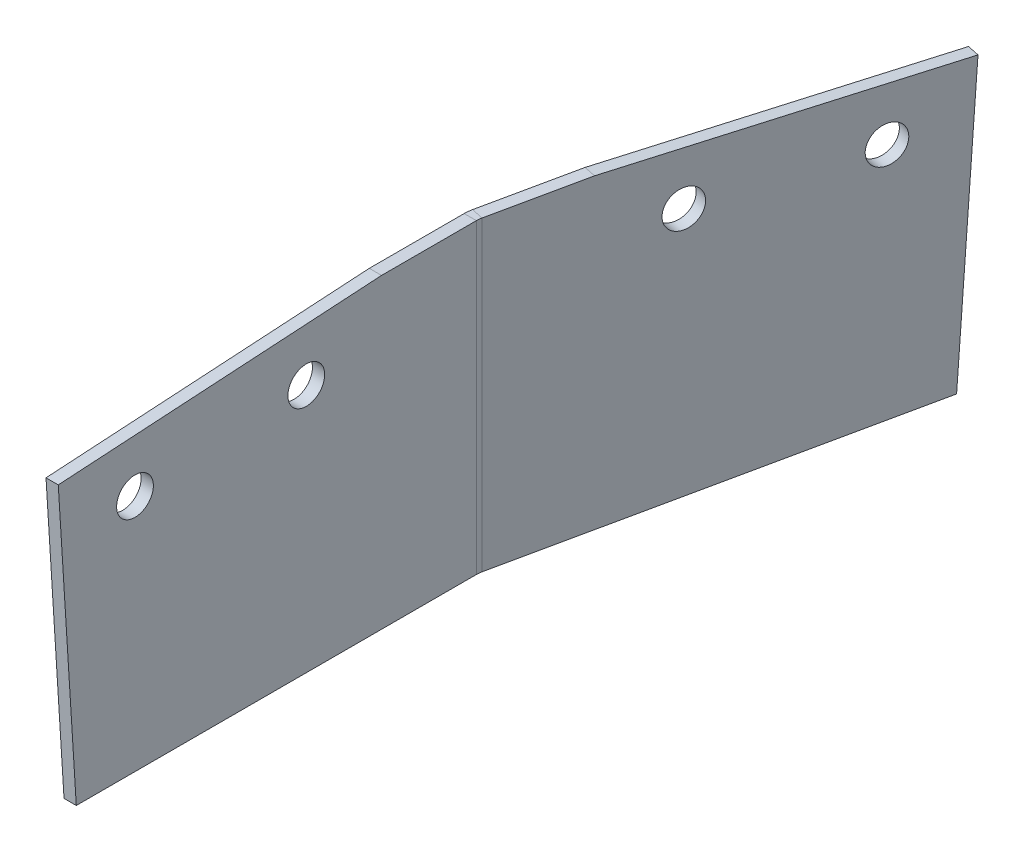
ISO-10303-21;
HEADER;
FILE_DESCRIPTION(('STEP AP214'),'2;1');
FILE_NAME('part.step','',(''),(''),'','','');
FILE_SCHEMA(('AUTOMOTIVE_DESIGN { 1 0 10303 214 1 1 1 1 }'));
ENDSEC;
DATA;
#1=APPLICATION_CONTEXT('core data for automotive mechanical design processes');
#2=APPLICATION_PROTOCOL_DEFINITION('international standard','automotive_design',2000,#1);
#3=PRODUCT_CONTEXT('',#1,'mechanical');
#4=PRODUCT('Part','Part','',(#3));
#5=PRODUCT_RELATED_PRODUCT_CATEGORY('part','',(#4));
#6=PRODUCT_DEFINITION_FORMATION('','',#4);
#7=PRODUCT_DEFINITION_CONTEXT('part definition',#1,'design');
#8=PRODUCT_DEFINITION('design','',#6,#7);
#9=PRODUCT_DEFINITION_SHAPE('','',#8);
#10=(LENGTH_UNIT() NAMED_UNIT(*) SI_UNIT(.MILLI.,.METRE.));
#11=(NAMED_UNIT(*) PLANE_ANGLE_UNIT() SI_UNIT($,.RADIAN.));
#12=(NAMED_UNIT(*) SI_UNIT($,.STERADIAN.) SOLID_ANGLE_UNIT());
#13=UNCERTAINTY_MEASURE_WITH_UNIT(LENGTH_MEASURE(1.E-05),#10,'distance_accuracy_value','');
#14=(GEOMETRIC_REPRESENTATION_CONTEXT(3) GLOBAL_UNCERTAINTY_ASSIGNED_CONTEXT((#13)) GLOBAL_UNIT_ASSIGNED_CONTEXT((#10,
#11,#12)) REPRESENTATION_CONTEXT('',''));
#15=CARTESIAN_POINT('',(0.,0.,0.));
#16=DIRECTION('',(0.,0.,1.));
#17=DIRECTION('',(1.,0.,0.));
#18=AXIS2_PLACEMENT_3D('',#15,#16,#17);
#19=CARTESIAN_POINT('',(-0.988873955573792,0.,-0.105857241604812));
#20=DIRECTION('',(0.978147600733805,0.,0.20791169081776));
#21=DIRECTION('',(0.20791169081776,0.,-0.978147600733806));
#22=AXIS2_PLACEMENT_3D('',#19,#20,#21);
#23=PLANE('',#22);
#24=CARTESIAN_POINT('',(1.95072377383127,7.81650663822684,-13.9355772291183));
#25=DIRECTION('',(0.978147600733805,0.,0.20791169081776));
#26=DIRECTION('',(0.20791169081776,0.,-0.978147600733806));
#27=AXIS2_PLACEMENT_3D('',#24,#25,#26);
#28=CIRCLE('',#27,1.5);
#29=CARTESIAN_POINT('',(2.2625913100579,7.81650663822684,-15.402798630219));
#30=VERTEX_POINT('',#29);
#31=EDGE_CURVE('E481',#30,#30,#28,.T.);
#32=ORIENTED_EDGE('',*,*,#31,.T.);
#33=EDGE_LOOP('',(#32));
#34=FACE_BOUND('',#33,.T.);
#35=CARTESIAN_POINT('',(4.85605828428634,6.96182708473889,-27.6041014451121));
#36=DIRECTION('',(0.978147600733805,0.,0.20791169081776));
#37=DIRECTION('',(0.20791169081776,0.,-0.978147600733806));
#38=AXIS2_PLACEMENT_3D('',#35,#36,#37);
#39=CIRCLE('',#38,1.5);
#40=CARTESIAN_POINT('',(5.16792582051298,6.96182708473889,-29.0713228462128));
#41=VERTEX_POINT('',#40);
#42=EDGE_CURVE('E483',#41,#41,#39,.T.);
#43=ORIENTED_EDGE('',*,*,#42,.T.);
#44=EDGE_LOOP('',(#43));
#45=FACE_BOUND('',#44,.T.);
#46=DIRECTION('',(0.20791169081776,0.,-0.978147600733806));
#47=VECTOR('',#46,1.);
#48=CARTESIAN_POINT('',(-7.82916858347809,-12.5,32.0751988225374));
#49=LINE('',#48,#47);
#50=CARTESIAN_POINT('',(-0.934442802201417,-12.5,-0.361935684654126));
#51=VERTEX_POINT('',#50);
#52=CARTESIAN_POINT('',(5.85142067233051,-12.5,-32.286913305747));
#53=VERTEX_POINT('',#52);
#54=EDGE_CURVE('E48',#51,#53,#49,.T.);
#55=ORIENTED_EDGE('',*,*,#54,.F.);
#56=DIRECTION('',(0.,1.,0.));
#57=VECTOR('',#56,1.);
#58=CARTESIAN_POINT('',(-0.934442802201416,0.,-0.361935684654129));
#59=LINE('',#58,#57);
#60=CARTESIAN_POINT('',(-0.934442802201417,12.5,-0.361935684654129));
#61=VERTEX_POINT('',#60);
#62=EDGE_CURVE('E147',#51,#61,#59,.T.);
#63=ORIENTED_EDGE('',*,*,#62,.T.);
#64=DIRECTION('',(-0.20791169081776,0.,0.978147600733806));
#65=VECTOR('',#64,1.);
#66=CARTESIAN_POINT('',(-2.65216748211587,12.5,7.71932356426563));
#67=LINE('',#66,#65);
#68=CARTESIAN_POINT('',(0.674419570968286,12.5,-7.93103804747526));
#69=VERTEX_POINT('',#68);
#70=EDGE_CURVE('E180',#69,#61,#67,.T.);
#71=ORIENTED_EDGE('',*,*,#70,.F.);
#72=DIRECTION('',(-0.207523893603934,0.0610485395348535,0.97632315828527));
#73=VECTOR('',#72,1.);
#74=CARTESIAN_POINT('',(0.674419570968286,12.5,-7.93103804747526));
#75=LINE('',#74,#73);
#76=CARTESIAN_POINT('',(6.15733962512973,10.8870567582365,-33.7261488221464));
#77=VERTEX_POINT('',#76);
#78=EDGE_CURVE('E177',#77,#69,#75,.T.);
#79=ORIENTED_EDGE('',*,*,#78,.F.);
#80=DIRECTION('',(0.0130548830826643,0.998026728428272,-0.0614183960264231));
#81=VECTOR('',#80,1.);
#82=CARTESIAN_POINT('',(6.15733962512973,10.8870567582365,-33.7261488221464));
#83=LINE('',#82,#81);
#84=EDGE_CURVE('E174',#53,#77,#83,.T.);
#85=ORIENTED_EDGE('',*,*,#84,.F.);
#86=EDGE_LOOP('',(#55,#63,#71,#79,#85));
#87=FACE_BOUND('',#86,.T.);
#88=ADVANCED_FACE('F44',(#34,#45,#87),#23,.F.);
#89=CARTESIAN_POINT('',(-2.65216748211587,12.5,7.71932356426563));
#90=DIRECTION('',(0.,1.,0.));
#91=DIRECTION('',(-0.20791169081776,0.,0.978147600733806));
#92=AXIS2_PLACEMENT_3D('',#89,#90,#91);
#93=PLANE('',#92);
#94=DIRECTION('',(-0.978147600733806,0.,-0.20791169081776));
#95=VECTOR('',#94,1.);
#96=CARTESIAN_POINT('',(-0.934442802201417,12.5,-0.36193568465413));
#97=LINE('',#96,#95);
#98=CARTESIAN_POINT('',(0.0437047985323894,12.5,-0.15402399383637));
#99=VERTEX_POINT('',#98);
#100=EDGE_CURVE('E12',#99,#61,#97,.T.);
#101=ORIENTED_EDGE('',*,*,#100,.F.);
#102=DIRECTION('',(-0.20791169081776,0.,0.978147600733806));
#103=VECTOR('',#102,1.);
#104=CARTESIAN_POINT('',(-1.67401988138206,12.5,7.92723525508339));
#105=LINE('',#104,#103);
#106=CARTESIAN_POINT('',(1.65256717170209,12.5,-7.7231263566575));
#107=VERTEX_POINT('',#106);
#108=EDGE_CURVE('E61',#107,#99,#105,.T.);
#109=ORIENTED_EDGE('',*,*,#108,.F.);
#110=DIRECTION('',(0.978147600733806,0.,0.20791169081776));
#111=VECTOR('',#110,1.);
#112=CARTESIAN_POINT('',(0.674419570968286,12.5,-7.93103804747526));
#113=LINE('',#112,#111);
#114=EDGE_CURVE('E186',#69,#107,#113,.T.);
#115=ORIENTED_EDGE('',*,*,#114,.F.);
#116=ORIENTED_EDGE('',*,*,#70,.T.);
#117=EDGE_LOOP('',(#101,#109,#115,#116));
#118=FACE_BOUND('',#117,.T.);
#119=ADVANCED_FACE('F46',(#118),#93,.T.);
#120=CARTESIAN_POINT('',(0.674419570968286,12.5,-7.93103804747526));
#121=DIRECTION('',(0.0126927050766462,0.998134798421867,-0.0597144824743198));
#122=DIRECTION('',(-0.207523893603934,0.0610485395348535,0.97632315828527));
#123=AXIS2_PLACEMENT_3D('',#120,#121,#122);
#124=PLANE('',#123);
#125=DIRECTION('',(-0.207523893603934,0.0610485395348535,0.97632315828527));
#126=VECTOR('',#125,1.);
#127=CARTESIAN_POINT('',(1.65256717170209,12.5,-7.7231263566575));
#128=LINE('',#127,#126);
#129=CARTESIAN_POINT('',(7.13548722586353,10.8870567582365,-33.5182371313286));
#130=VERTEX_POINT('',#129);
#131=EDGE_CURVE('E184',#130,#107,#128,.T.);
#132=ORIENTED_EDGE('',*,*,#131,.F.);
#133=DIRECTION('',(0.978147600733806,0.,0.20791169081776));
#134=VECTOR('',#133,1.);
#135=CARTESIAN_POINT('',(6.15733962512973,10.8870567582365,-33.7261488221464));
#136=LINE('',#135,#134);
#137=EDGE_CURVE('E188',#77,#130,#136,.T.);
#138=ORIENTED_EDGE('',*,*,#137,.F.);
#139=ORIENTED_EDGE('',*,*,#78,.T.);
#140=ORIENTED_EDGE('',*,*,#114,.T.);
#141=EDGE_LOOP('',(#132,#138,#139,#140));
#142=FACE_BOUND('',#141,.T.);
#143=ADVANCED_FACE('F246',(#142),#124,.T.);
#144=CARTESIAN_POINT('',(6.15733962512973,10.8870567582365,-33.7261488221464));
#145=DIRECTION('',(0.207501424588839,-0.0627905195293094,-0.976217449880324));
#146=DIRECTION('',(0.0130548830826643,0.998026728428272,-0.0614183960264232));
#147=AXIS2_PLACEMENT_3D('',#144,#145,#146);
#148=PLANE('',#147);
#149=DIRECTION('',(0.0130548830826643,0.998026728428272,-0.0614183960264231));
#150=VECTOR('',#149,1.);
#151=CARTESIAN_POINT('',(7.13548722586353,10.8870567582365,-33.5182371313286));
#152=LINE('',#151,#150);
#153=CARTESIAN_POINT('',(6.82956827306431,-12.5,-32.0790016149293));
#154=VERTEX_POINT('',#153);
#155=EDGE_CURVE('E181',#154,#130,#152,.T.);
#156=ORIENTED_EDGE('',*,*,#155,.F.);
#157=DIRECTION('',(0.978147600733806,0.,0.20791169081776));
#158=VECTOR('',#157,1.);
#159=CARTESIAN_POINT('',(5.85142067233051,-12.5,-32.286913305747));
#160=LINE('',#159,#158);
#161=EDGE_CURVE('E190',#53,#154,#160,.T.);
#162=ORIENTED_EDGE('',*,*,#161,.F.);
#163=ORIENTED_EDGE('',*,*,#84,.T.);
#164=ORIENTED_EDGE('',*,*,#137,.T.);
#165=EDGE_LOOP('',(#156,#162,#163,#164));
#166=FACE_BOUND('',#165,.T.);
#167=ADVANCED_FACE('F252',(#166),#148,.T.);
#168=CARTESIAN_POINT('',(-7.82916858347809,-12.5,32.0751988225374));
#169=DIRECTION('',(0.,-1.,0.));
#170=DIRECTION('',(0.20791169081776,0.,-0.978147600733806));
#171=AXIS2_PLACEMENT_3D('',#168,#169,#170);
#172=PLANE('',#171);
#173=DIRECTION('',(0.978147600733806,0.,0.20791169081776));
#174=VECTOR('',#173,1.);
#175=CARTESIAN_POINT('',(-0.934442802201419,-12.5,-0.361935684654127));
#176=LINE('',#175,#174);
#177=CARTESIAN_POINT('',(0.0437047985323887,-12.5,-0.154023993836367));
#178=VERTEX_POINT('',#177);
#179=EDGE_CURVE('E193',#51,#178,#176,.T.);
#180=ORIENTED_EDGE('',*,*,#179,.F.);
#181=ORIENTED_EDGE('',*,*,#54,.T.);
#182=ORIENTED_EDGE('',*,*,#161,.T.);
#183=DIRECTION('',(0.20791169081776,0.,-0.978147600733806));
#184=VECTOR('',#183,1.);
#185=CARTESIAN_POINT('',(-6.85102098274428,-12.5,32.2831105133552));
#186=LINE('',#185,#184);
#187=EDGE_CURVE('E69',#178,#154,#186,.T.);
#188=ORIENTED_EDGE('',*,*,#187,.F.);
#189=EDGE_LOOP('',(#180,#181,#182,#188));
#190=FACE_BOUND('',#189,.T.);
#191=ADVANCED_FACE('F237',(#190),#172,.T.);
#192=CARTESIAN_POINT('',(-0.0107263548399864,0.,0.102054449212948));
#193=DIRECTION('',(0.978147600733805,0.,0.20791169081776));
#194=DIRECTION('',(0.20791169081776,0.,-0.978147600733806));
#195=AXIS2_PLACEMENT_3D('',#192,#193,#194);
#196=PLANE('',#195);
#197=CARTESIAN_POINT('',(2.92887137456507,7.81650663822684,-13.7276655383006));
#198=DIRECTION('',(0.978147600733805,0.,0.20791169081776));
#199=DIRECTION('',(0.20791169081776,0.,-0.978147600733806));
#200=AXIS2_PLACEMENT_3D('',#197,#198,#199);
#201=CIRCLE('',#200,1.5);
#202=CARTESIAN_POINT('',(3.24073891079171,7.81650663822684,-15.1948869394013));
#203=VERTEX_POINT('',#202);
#204=EDGE_CURVE('E479',#203,#203,#201,.T.);
#205=ORIENTED_EDGE('',*,*,#204,.F.);
#206=EDGE_LOOP('',(#205));
#207=FACE_BOUND('',#206,.T.);
#208=CARTESIAN_POINT('',(5.83420588502015,6.96182708473889,-27.3961897542943));
#209=DIRECTION('',(0.978147600733805,0.,0.20791169081776));
#210=DIRECTION('',(0.20791169081776,0.,-0.978147600733806));
#211=AXIS2_PLACEMENT_3D('',#208,#209,#210);
#212=CIRCLE('',#211,1.5);
#213=CARTESIAN_POINT('',(6.14607342124679,6.96182708473889,-28.863411155395));
#214=VERTEX_POINT('',#213);
#215=EDGE_CURVE('E494',#214,#214,#212,.T.);
#216=ORIENTED_EDGE('',*,*,#215,.F.);
#217=EDGE_LOOP('',(#216));
#218=FACE_BOUND('',#217,.T.);
#219=DIRECTION('',(0.,1.,0.));
#220=VECTOR('',#219,1.);
#221=CARTESIAN_POINT('',(0.0437047985323893,0.,-0.15402399383637));
#222=LINE('',#221,#220);
#223=EDGE_CURVE('E53',#178,#99,#222,.T.);
#224=ORIENTED_EDGE('',*,*,#223,.F.);
#225=ORIENTED_EDGE('',*,*,#187,.T.);
#226=ORIENTED_EDGE('',*,*,#155,.T.);
#227=ORIENTED_EDGE('',*,*,#131,.T.);
#228=ORIENTED_EDGE('',*,*,#108,.T.);
#229=EDGE_LOOP('',(#224,#225,#226,#227,#228));
#230=FACE_BOUND('',#229,.T.);
#231=ADVANCED_FACE('F230',(#207,#218,#230),#196,.T.);
#232=CARTESIAN_POINT('',(-1.,12.5,8.));
#233=DIRECTION('',(0.,0.998134798421867,0.0610485395348537));
#234=DIRECTION('',(0.,-0.0610485395348537,0.998134798421867));
#235=AXIS2_PLACEMENT_3D('',#232,#233,#234);
#236=PLANE('',#235);
#237=DIRECTION('',(0.,-0.0610485395348537,0.998134798421867));
#238=VECTOR('',#237,1.);
#239=CARTESIAN_POINT('',(0.,12.5,8.));
#240=LINE('',#239,#238);
#241=CARTESIAN_POINT('',(0.,12.5,8.));
#242=VERTEX_POINT('',#241);
#243=CARTESIAN_POINT('',(0.,10.8870567582365,34.3713888939866));
#244=VERTEX_POINT('',#243);
#245=EDGE_CURVE('E214',#242,#244,#240,.T.);
#246=ORIENTED_EDGE('',*,*,#245,.F.);
#247=DIRECTION('',(1.,0.,0.));
#248=VECTOR('',#247,1.);
#249=CARTESIAN_POINT('',(-1.,12.5,8.));
#250=LINE('',#249,#248);
#251=CARTESIAN_POINT('',(-1.,12.5,8.));
#252=VERTEX_POINT('',#251);
#253=EDGE_CURVE('E198',#252,#242,#250,.T.);
#254=ORIENTED_EDGE('',*,*,#253,.F.);
#255=DIRECTION('',(0.,-0.0610485395348537,0.998134798421867));
#256=VECTOR('',#255,1.);
#257=CARTESIAN_POINT('',(-1.,12.5,8.));
#258=LINE('',#257,#256);
#259=CARTESIAN_POINT('',(-1.,10.8870567582365,34.3713888939866));
#260=VERTEX_POINT('',#259);
#261=EDGE_CURVE('E160',#252,#260,#258,.T.);
#262=ORIENTED_EDGE('',*,*,#261,.T.);
#263=DIRECTION('',(1.,0.,0.));
#264=VECTOR('',#263,1.);
#265=CARTESIAN_POINT('',(-1.,10.8870567582365,34.3713888939866));
#266=LINE('',#265,#264);
#267=EDGE_CURVE('E170',#260,#244,#266,.T.);
#268=ORIENTED_EDGE('',*,*,#267,.T.);
#269=EDGE_LOOP('',(#246,#254,#262,#268));
#270=FACE_BOUND('',#269,.T.);
#271=ADVANCED_FACE('F228',(#270),#236,.T.);
#272=CARTESIAN_POINT('',(-1.,10.8870567582365,34.3713888939866));
#273=DIRECTION('',(0.,-0.0627905195293094,0.998026728428272));
#274=DIRECTION('',(0.,-0.998026728428272,-0.0627905195293094));
#275=AXIS2_PLACEMENT_3D('',#272,#273,#274);
#276=PLANE('',#275);
#277=DIRECTION('',(0.,-0.998026728428272,-0.0627905195293094));
#278=VECTOR('',#277,1.);
#279=CARTESIAN_POINT('',(0.,10.8870567582365,34.3713888939866));
#280=LINE('',#279,#278);
#281=CARTESIAN_POINT('',(0.,-12.5,32.9));
#282=VERTEX_POINT('',#281);
#283=EDGE_CURVE('E211',#244,#282,#280,.T.);
#284=ORIENTED_EDGE('',*,*,#283,.F.);
#285=ORIENTED_EDGE('',*,*,#267,.F.);
#286=DIRECTION('',(0.,-0.998026728428272,-0.0627905195293094));
#287=VECTOR('',#286,1.);
#288=CARTESIAN_POINT('',(-1.,10.8870567582365,34.3713888939866));
#289=LINE('',#288,#287);
#290=CARTESIAN_POINT('',(-1.,-12.5,32.9));
#291=VERTEX_POINT('',#290);
#292=EDGE_CURVE('E165',#260,#291,#289,.T.);
#293=ORIENTED_EDGE('',*,*,#292,.T.);
#294=DIRECTION('',(1.,0.,0.));
#295=VECTOR('',#294,1.);
#296=CARTESIAN_POINT('',(-1.,-12.5,32.9));
#297=LINE('',#296,#295);
#298=EDGE_CURVE('E163',#291,#282,#297,.T.);
#299=ORIENTED_EDGE('',*,*,#298,.T.);
#300=EDGE_LOOP('',(#284,#285,#293,#299));
#301=FACE_BOUND('',#300,.T.);
#302=ADVANCED_FACE('F226',(#301),#276,.T.);
#303=CARTESIAN_POINT('',(-1.,0.,0.));
#304=DIRECTION('',(1.,0.,0.));
#305=DIRECTION('',(0.,0.,-1.));
#306=AXIS2_PLACEMENT_3D('',#303,#304,#305);
#307=PLANE('',#306);
#308=CARTESIAN_POINT('',(-0.999999999999999,6.96182708473888,28.1125713367575));
#309=DIRECTION('',(1.,0.,0.));
#310=DIRECTION('',(0.,0.,-1.));
#311=AXIS2_PLACEMENT_3D('',#308,#309,#310);
#312=CIRCLE('',#311,1.5);
#313=CARTESIAN_POINT('',(-0.999999999999999,6.96182708473888,26.6125713367575));
#314=VERTEX_POINT('',#313);
#315=EDGE_CURVE('E263',#314,#314,#312,.T.);
#316=ORIENTED_EDGE('',*,*,#315,.T.);
#317=EDGE_LOOP('',(#316));
#318=FACE_BOUND('',#317,.T.);
#319=CARTESIAN_POINT('',(-0.999999999999999,7.81650663822684,14.1386841588513));
#320=DIRECTION('',(1.,0.,0.));
#321=DIRECTION('',(0.,0.,-1.));
#322=AXIS2_PLACEMENT_3D('',#319,#320,#321);
#323=CIRCLE('',#322,1.5);
#324=CARTESIAN_POINT('',(-0.999999999999999,7.81650663822684,12.6386841588513));
#325=VERTEX_POINT('',#324);
#326=EDGE_CURVE('E266',#325,#325,#323,.T.);
#327=ORIENTED_EDGE('',*,*,#326,.T.);
#328=EDGE_LOOP('',(#327));
#329=FACE_BOUND('',#328,.T.);
#330=DIRECTION('',(0.,1.,0.));
#331=VECTOR('',#330,1.);
#332=CARTESIAN_POINT('',(-1.,0.,0.26179938779915));
#333=LINE('',#332,#331);
#334=CARTESIAN_POINT('',(-1.,-12.5,0.261799387799148));
#335=VERTEX_POINT('',#334);
#336=CARTESIAN_POINT('',(-1.,12.5,0.261799387799151));
#337=VERTEX_POINT('',#336);
#338=EDGE_CURVE('E144',#335,#337,#333,.T.);
#339=ORIENTED_EDGE('',*,*,#338,.F.);
#340=DIRECTION('',(0.,0.,-1.));
#341=VECTOR('',#340,1.);
#342=CARTESIAN_POINT('',(-1.,-12.5,32.9));
#343=LINE('',#342,#341);
#344=EDGE_CURVE('E138',#291,#335,#343,.T.);
#345=ORIENTED_EDGE('',*,*,#344,.F.);
#346=ORIENTED_EDGE('',*,*,#292,.F.);
#347=ORIENTED_EDGE('',*,*,#261,.F.);
#348=DIRECTION('',(0.,0.,1.));
#349=VECTOR('',#348,1.);
#350=CARTESIAN_POINT('',(-1.,12.5,8.));
#351=LINE('',#350,#349);
#352=EDGE_CURVE('E158',#337,#252,#351,.T.);
#353=ORIENTED_EDGE('',*,*,#352,.F.);
#354=EDGE_LOOP('',(#339,#345,#346,#347,#353));
#355=FACE_BOUND('',#354,.T.);
#356=ADVANCED_FACE('F154',(#318,#329,#355),#307,.F.);
#357=CARTESIAN_POINT('',(-1.,-12.5,32.9));
#358=DIRECTION('',(0.,-1.,0.));
#359=DIRECTION('',(0.,0.,-1.));
#360=AXIS2_PLACEMENT_3D('',#357,#358,#359);
#361=PLANE('',#360);
#362=ORIENTED_EDGE('',*,*,#344,.T.);
#363=DIRECTION('',(1.,0.,0.));
#364=VECTOR('',#363,1.);
#365=CARTESIAN_POINT('',(-1.,-12.5,0.261799387799147));
#366=LINE('',#365,#364);
#367=CARTESIAN_POINT('',(0.,-12.5,0.261799387799147));
#368=VERTEX_POINT('',#367);
#369=EDGE_CURVE('E125',#335,#368,#366,.T.);
#370=ORIENTED_EDGE('',*,*,#369,.T.);
#371=DIRECTION('',(0.,0.,-1.));
#372=VECTOR('',#371,1.);
#373=CARTESIAN_POINT('',(0.,-12.5,32.9));
#374=LINE('',#373,#372);
#375=EDGE_CURVE('E137',#282,#368,#374,.T.);
#376=ORIENTED_EDGE('',*,*,#375,.F.);
#377=ORIENTED_EDGE('',*,*,#298,.F.);
#378=EDGE_LOOP('',(#362,#370,#376,#377));
#379=FACE_BOUND('',#378,.T.);
#380=ADVANCED_FACE('F162',(#379),#361,.T.);
#381=CARTESIAN_POINT('',(0.,0.,0.));
#382=DIRECTION('',(1.,0.,0.));
#383=DIRECTION('',(0.,0.,-1.));
#384=AXIS2_PLACEMENT_3D('',#381,#382,#383);
#385=PLANE('',#384);
#386=CARTESIAN_POINT('',(0.,6.96182708473888,28.1125713367575));
#387=DIRECTION('',(1.,0.,0.));
#388=DIRECTION('',(0.,0.,-1.));
#389=AXIS2_PLACEMENT_3D('',#386,#387,#388);
#390=CIRCLE('',#389,1.5);
#391=CARTESIAN_POINT('',(0.,6.96182708473888,26.6125713367575));
#392=VERTEX_POINT('',#391);
#393=EDGE_CURVE('E271',#392,#392,#390,.T.);
#394=ORIENTED_EDGE('',*,*,#393,.F.);
#395=EDGE_LOOP('',(#394));
#396=FACE_BOUND('',#395,.T.);
#397=CARTESIAN_POINT('',(0.,7.81650663822684,14.1386841588513));
#398=DIRECTION('',(1.,0.,0.));
#399=DIRECTION('',(0.,0.,-1.));
#400=AXIS2_PLACEMENT_3D('',#397,#398,#399);
#401=CIRCLE('',#400,1.5);
#402=CARTESIAN_POINT('',(0.,7.81650663822684,12.6386841588513));
#403=VERTEX_POINT('',#402);
#404=EDGE_CURVE('E482',#403,#403,#401,.T.);
#405=ORIENTED_EDGE('',*,*,#404,.F.);
#406=EDGE_LOOP('',(#405));
#407=FACE_BOUND('',#406,.T.);
#408=ORIENTED_EDGE('',*,*,#375,.T.);
#409=DIRECTION('',(0.,1.,0.));
#410=VECTOR('',#409,1.);
#411=CARTESIAN_POINT('',(0.,0.,0.26179938779915));
#412=LINE('',#411,#410);
#413=CARTESIAN_POINT('',(0.,12.5,0.26179938779915));
#414=VERTEX_POINT('',#413);
#415=EDGE_CURVE('E219',#368,#414,#412,.T.);
#416=ORIENTED_EDGE('',*,*,#415,.T.);
#417=DIRECTION('',(0.,0.,1.));
#418=VECTOR('',#417,1.);
#419=CARTESIAN_POINT('',(0.,12.5,8.));
#420=LINE('',#419,#418);
#421=EDGE_CURVE('E217',#414,#242,#420,.T.);
#422=ORIENTED_EDGE('',*,*,#421,.T.);
#423=ORIENTED_EDGE('',*,*,#245,.T.);
#424=ORIENTED_EDGE('',*,*,#283,.T.);
#425=EDGE_LOOP('',(#408,#416,#422,#423,#424));
#426=FACE_BOUND('',#425,.T.);
#427=ADVANCED_FACE('F223',(#396,#407,#426),#385,.T.);
#428=CARTESIAN_POINT('',(-1.,12.5,8.));
#429=DIRECTION('',(0.,1.,0.));
#430=DIRECTION('',(0.,0.,1.));
#431=AXIS2_PLACEMENT_3D('',#428,#429,#430);
#432=PLANE('',#431);
#433=ORIENTED_EDGE('',*,*,#421,.F.);
#434=DIRECTION('',(-1.,0.,0.));
#435=VECTOR('',#434,1.);
#436=CARTESIAN_POINT('',(-1.,12.5,0.26179938779915));
#437=LINE('',#436,#435);
#438=EDGE_CURVE('E205',#414,#337,#437,.T.);
#439=ORIENTED_EDGE('',*,*,#438,.T.);
#440=ORIENTED_EDGE('',*,*,#352,.T.);
#441=ORIENTED_EDGE('',*,*,#253,.T.);
#442=EDGE_LOOP('',(#433,#439,#440,#441));
#443=FACE_BOUND('',#442,.T.);
#444=ADVANCED_FACE('F288',(#443),#432,.T.);
#445=CARTESIAN_POINT('',(2.,-12.5,0.26179938779915));
#446=DIRECTION('',(0.,-1.,0.));
#447=DIRECTION('',(0.,0.,-1.));
#448=AXIS2_PLACEMENT_3D('',#445,#446,#447);
#449=PLANE('',#448);
#450=ORIENTED_EDGE('',*,*,#179,.T.);
#451=CARTESIAN_POINT('',(2.,-12.5,0.26179938779915));
#452=DIRECTION('',(0.,-1.,0.));
#453=DIRECTION('',(0.,0.,-1.));
#454=AXIS2_PLACEMENT_3D('',#451,#452,#453);
#455=CIRCLE('',#454,2.);
#456=EDGE_CURVE('E132',#178,#368,#455,.F.);
#457=ORIENTED_EDGE('',*,*,#456,.T.);
#458=ORIENTED_EDGE('',*,*,#369,.F.);
#459=CARTESIAN_POINT('',(2.,-12.5,0.26179938779915));
#460=DIRECTION('',(0.,1.,0.));
#461=DIRECTION('',(0.,0.,-1.));
#462=AXIS2_PLACEMENT_3D('',#459,#460,#461);
#463=CIRCLE('',#462,3.);
#464=EDGE_CURVE('E129',#51,#335,#463,.T.);
#465=ORIENTED_EDGE('',*,*,#464,.F.);
#466=EDGE_LOOP('',(#450,#457,#458,#465));
#467=FACE_BOUND('',#466,.T.);
#468=ADVANCED_FACE('F128',(#467),#449,.T.);
#469=CARTESIAN_POINT('',(2.,12.5,0.26179938779915));
#470=DIRECTION('',(0.,1.,0.));
#471=DIRECTION('',(0.,0.,1.));
#472=AXIS2_PLACEMENT_3D('',#469,#470,#471);
#473=PLANE('',#472);
#474=ORIENTED_EDGE('',*,*,#438,.F.);
#475=CARTESIAN_POINT('',(2.,12.5,0.26179938779915));
#476=DIRECTION('',(0.,-1.,0.));
#477=DIRECTION('',(0.,0.,-1.));
#478=AXIS2_PLACEMENT_3D('',#475,#476,#477);
#479=CIRCLE('',#478,2.);
#480=EDGE_CURVE('E149',#414,#99,#479,.T.);
#481=ORIENTED_EDGE('',*,*,#480,.T.);
#482=ORIENTED_EDGE('',*,*,#100,.T.);
#483=CARTESIAN_POINT('',(2.,12.5,0.26179938779915));
#484=DIRECTION('',(0.,-1.,0.));
#485=DIRECTION('',(0.,0.,1.));
#486=AXIS2_PLACEMENT_3D('',#483,#484,#485);
#487=CIRCLE('',#486,3.);
#488=EDGE_CURVE('E148',#337,#61,#487,.T.);
#489=ORIENTED_EDGE('',*,*,#488,.F.);
#490=EDGE_LOOP('',(#474,#481,#482,#489));
#491=FACE_BOUND('',#490,.T.);
#492=ADVANCED_FACE('F276',(#491),#473,.T.);
#493=CARTESIAN_POINT('',(2.,25.0254701389966,0.26179938779915));
#494=DIRECTION('',(0.,-1.,0.));
#495=DIRECTION('',(0.,0.,-1.));
#496=AXIS2_PLACEMENT_3D('',#493,#494,#495);
#497=CYLINDRICAL_SURFACE('',#496,3.);
#498=ORIENTED_EDGE('',*,*,#488,.T.);
#499=ORIENTED_EDGE('',*,*,#62,.F.);
#500=ORIENTED_EDGE('',*,*,#464,.T.);
#501=ORIENTED_EDGE('',*,*,#338,.T.);
#502=EDGE_LOOP('',(#498,#499,#500,#501));
#503=FACE_BOUND('',#502,.T.);
#504=ADVANCED_FACE('F143',(#503),#497,.T.);
#505=CARTESIAN_POINT('',(2.,25.0254701389966,0.26179938779915));
#506=DIRECTION('',(0.,-1.,0.));
#507=DIRECTION('',(0.,0.,-1.));
#508=AXIS2_PLACEMENT_3D('',#505,#506,#507);
#509=CYLINDRICAL_SURFACE('',#508,2.);
#510=ORIENTED_EDGE('',*,*,#480,.F.);
#511=ORIENTED_EDGE('',*,*,#415,.F.);
#512=ORIENTED_EDGE('',*,*,#456,.F.);
#513=ORIENTED_EDGE('',*,*,#223,.T.);
#514=EDGE_LOOP('',(#510,#511,#512,#513));
#515=FACE_BOUND('',#514,.T.);
#516=ADVANCED_FACE('F262',(#515),#509,.F.);
#517=CARTESIAN_POINT('',(-10.,7.81650663822684,14.1386841588513));
#518=DIRECTION('',(1.,0.,0.));
#519=DIRECTION('',(0.,0.,-1.));
#520=AXIS2_PLACEMENT_3D('',#517,#518,#519);
#521=CYLINDRICAL_SURFACE('',#520,1.5);
#522=ORIENTED_EDGE('',*,*,#404,.T.);
#523=EDGE_LOOP('',(#522));
#524=FACE_BOUND('',#523,.T.);
#525=ORIENTED_EDGE('',*,*,#326,.F.);
#526=EDGE_LOOP('',(#525));
#527=FACE_BOUND('',#526,.T.);
#528=ADVANCED_FACE('F302',(#524,#527),#521,.F.);
#529=CARTESIAN_POINT('',(-10.,6.96182708473888,28.1125713367575));
#530=DIRECTION('',(1.,0.,0.));
#531=DIRECTION('',(0.,0.,-1.));
#532=AXIS2_PLACEMENT_3D('',#529,#530,#531);
#533=CYLINDRICAL_SURFACE('',#532,1.5);
#534=ORIENTED_EDGE('',*,*,#393,.T.);
#535=EDGE_LOOP('',(#534));
#536=FACE_BOUND('',#535,.T.);
#537=ORIENTED_EDGE('',*,*,#315,.F.);
#538=EDGE_LOOP('',(#537));
#539=FACE_BOUND('',#538,.T.);
#540=ADVANCED_FACE('F304',(#536,#539),#533,.F.);
#541=CARTESIAN_POINT('',(-3.9472701223179,6.96182708473889,-29.4753066624719));
#542=DIRECTION('',(0.978147600733806,0.,0.20791169081776));
#543=DIRECTION('',(0.20791169081776,0.,-0.978147600733806));
#544=AXIS2_PLACEMENT_3D('',#541,#542,#543);
#545=CYLINDRICAL_SURFACE('',#544,1.5);
#546=ORIENTED_EDGE('',*,*,#215,.T.);
#547=EDGE_LOOP('',(#546));
#548=FACE_BOUND('',#547,.T.);
#549=ORIENTED_EDGE('',*,*,#42,.F.);
#550=EDGE_LOOP('',(#549));
#551=FACE_BOUND('',#550,.T.);
#552=ADVANCED_FACE('F311',(#548,#551),#545,.F.);
#553=CARTESIAN_POINT('',(-6.85260463277298,7.81650663822684,-15.8067824464782));
#554=DIRECTION('',(0.978147600733806,0.,0.20791169081776));
#555=DIRECTION('',(0.20791169081776,0.,-0.978147600733806));
#556=AXIS2_PLACEMENT_3D('',#553,#554,#555);
#557=CYLINDRICAL_SURFACE('',#556,1.5);
#558=ORIENTED_EDGE('',*,*,#204,.T.);
#559=EDGE_LOOP('',(#558));
#560=FACE_BOUND('',#559,.T.);
#561=ORIENTED_EDGE('',*,*,#31,.F.);
#562=EDGE_LOOP('',(#561));
#563=FACE_BOUND('',#562,.T.);
#564=ADVANCED_FACE('F387',(#560,#563),#557,.F.);
#565=CLOSED_SHELL('',(#88,#119,#143,#167,#191,#231,#271,#302,#356,#380,#427,#444,#468,#492,#504,
#516,#528,#540,#552,#564));
#566=MANIFOLD_SOLID_BREP('B2',#565);
#567=ADVANCED_BREP_SHAPE_REPRESENTATION('',(#18,#566),#14);
#568=SHAPE_DEFINITION_REPRESENTATION(#9,#567);
ENDSEC;
END-ISO-10303-21;
